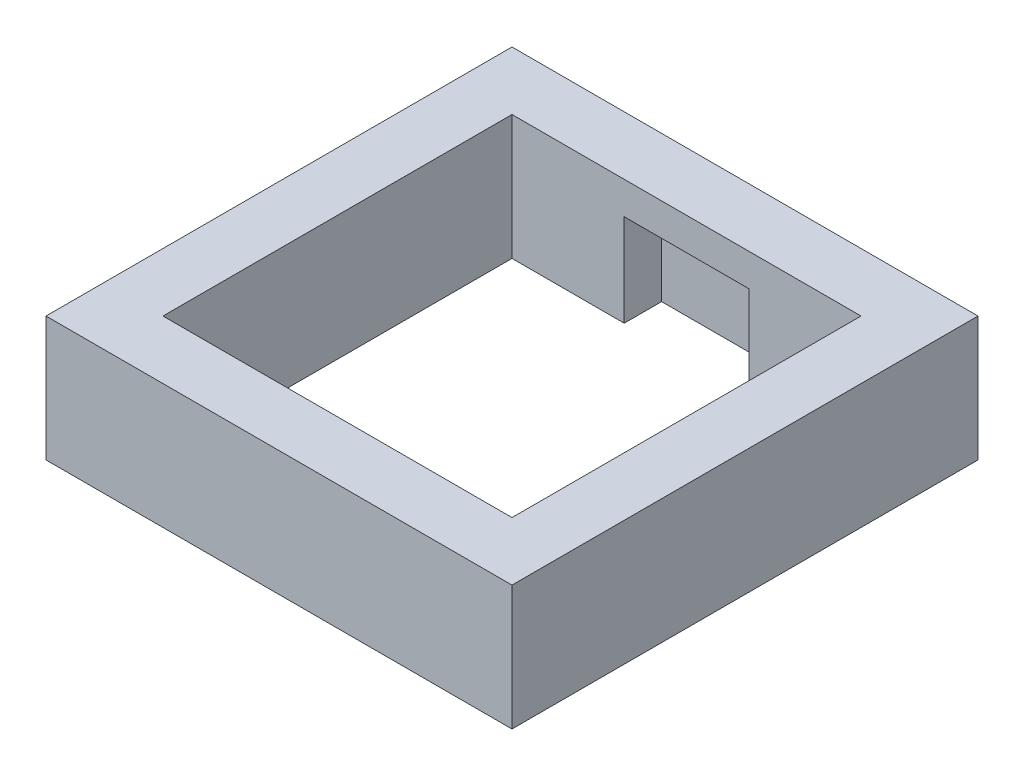
ISO-10303-21;
HEADER;
FILE_DESCRIPTION(('STEP AP214'),'2;1');
FILE_NAME('part.step','',(''),(''),'','','');
FILE_SCHEMA(('AUTOMOTIVE_DESIGN { 1 0 10303 214 1 1 1 1 }'));
ENDSEC;
DATA;
#1=APPLICATION_CONTEXT('core data for automotive mechanical design processes');
#2=APPLICATION_PROTOCOL_DEFINITION('international standard','automotive_design',2000,#1);
#3=PRODUCT_CONTEXT('',#1,'mechanical');
#4=PRODUCT('Part','Part','',(#3));
#5=PRODUCT_RELATED_PRODUCT_CATEGORY('part','',(#4));
#6=PRODUCT_DEFINITION_FORMATION('','',#4);
#7=PRODUCT_DEFINITION_CONTEXT('part definition',#1,'design');
#8=PRODUCT_DEFINITION('design','',#6,#7);
#9=PRODUCT_DEFINITION_SHAPE('','',#8);
#10=(LENGTH_UNIT() NAMED_UNIT(*) SI_UNIT(.MILLI.,.METRE.));
#11=(NAMED_UNIT(*) PLANE_ANGLE_UNIT() SI_UNIT($,.RADIAN.));
#12=(NAMED_UNIT(*) SI_UNIT($,.STERADIAN.) SOLID_ANGLE_UNIT());
#13=UNCERTAINTY_MEASURE_WITH_UNIT(LENGTH_MEASURE(1.E-05),#10,'distance_accuracy_value','');
#14=(GEOMETRIC_REPRESENTATION_CONTEXT(3) GLOBAL_UNCERTAINTY_ASSIGNED_CONTEXT((#13)) GLOBAL_UNIT_ASSIGNED_CONTEXT((#10,
#11,#12)) REPRESENTATION_CONTEXT('',''));
#15=CARTESIAN_POINT('',(0.,0.,0.));
#16=DIRECTION('',(0.,0.,1.));
#17=DIRECTION('',(1.,0.,0.));
#18=AXIS2_PLACEMENT_3D('',#15,#16,#17);
#19=CARTESIAN_POINT('',(0.,5.,-7.));
#20=DIRECTION('',(0.,0.,-1.));
#21=DIRECTION('',(-1.,0.,0.));
#22=AXIS2_PLACEMENT_3D('',#19,#20,#21);
#23=PLANE('',#22);
#24=DIRECTION('',(0.,-1.,0.));
#25=VECTOR('',#24,1.);
#26=CARTESIAN_POINT('',(-2.5,3.7,-7.));
#27=LINE('',#26,#25);
#28=CARTESIAN_POINT('',(-2.5,3.7,-7.));
#29=VERTEX_POINT('',#28);
#30=CARTESIAN_POINT('',(-2.5,0.,-7.));
#31=VERTEX_POINT('',#30);
#32=EDGE_CURVE('E192',#29,#31,#27,.T.);
#33=ORIENTED_EDGE('',*,*,#32,.F.);
#34=DIRECTION('',(-1.,0.,0.));
#35=VECTOR('',#34,1.);
#36=CARTESIAN_POINT('',(0.,3.7,-7.));
#37=LINE('',#36,#35);
#38=CARTESIAN_POINT('',(2.5,3.7,-7.));
#39=VERTEX_POINT('',#38);
#40=EDGE_CURVE('E170',#39,#29,#37,.T.);
#41=ORIENTED_EDGE('',*,*,#40,.F.);
#42=DIRECTION('',(0.,-1.,0.));
#43=VECTOR('',#42,1.);
#44=CARTESIAN_POINT('',(2.5,3.7,-7.));
#45=LINE('',#44,#43);
#46=CARTESIAN_POINT('',(2.5,0.,-7.));
#47=VERTEX_POINT('',#46);
#48=EDGE_CURVE('E196',#39,#47,#45,.T.);
#49=ORIENTED_EDGE('',*,*,#48,.T.);
#50=DIRECTION('',(1.,0.,0.));
#51=VECTOR('',#50,1.);
#52=CARTESIAN_POINT('',(0.,0.,-7.));
#53=LINE('',#52,#51);
#54=CARTESIAN_POINT('',(7.,0.,-7.));
#55=VERTEX_POINT('',#54);
#56=EDGE_CURVE('E195',#47,#55,#53,.T.);
#57=ORIENTED_EDGE('',*,*,#56,.T.);
#58=DIRECTION('',(0.,-1.,0.));
#59=VECTOR('',#58,1.);
#60=CARTESIAN_POINT('',(7.,5.,-7.));
#61=LINE('',#60,#59);
#62=CARTESIAN_POINT('',(7.,5.,-7.));
#63=VERTEX_POINT('',#62);
#64=EDGE_CURVE('E42',#63,#55,#61,.T.);
#65=ORIENTED_EDGE('',*,*,#64,.F.);
#66=DIRECTION('',(1.,0.,0.));
#67=VECTOR('',#66,1.);
#68=CARTESIAN_POINT('',(0.,5.,-7.));
#69=LINE('',#68,#67);
#70=CARTESIAN_POINT('',(-7.,5.,-7.));
#71=VERTEX_POINT('',#70);
#72=EDGE_CURVE('E238',#71,#63,#69,.T.);
#73=ORIENTED_EDGE('',*,*,#72,.F.);
#74=DIRECTION('',(0.,-1.,0.));
#75=VECTOR('',#74,1.);
#76=CARTESIAN_POINT('',(-7.,5.,-7.));
#77=LINE('',#76,#75);
#78=CARTESIAN_POINT('',(-7.,0.,-7.));
#79=VERTEX_POINT('',#78);
#80=EDGE_CURVE('E266',#71,#79,#77,.T.);
#81=ORIENTED_EDGE('',*,*,#80,.T.);
#82=EDGE_CURVE('E267',#79,#31,#53,.T.);
#83=ORIENTED_EDGE('',*,*,#82,.T.);
#84=EDGE_LOOP('',(#33,#41,#49,#57,#65,#73,#81,#83));
#85=FACE_BOUND('',#84,.T.);
#86=ADVANCED_FACE('F39',(#85),#23,.F.);
#87=CARTESIAN_POINT('',(0.,0.,0.));
#88=DIRECTION('',(0.,1.,0.));
#89=DIRECTION('',(0.,0.,1.));
#90=AXIS2_PLACEMENT_3D('',#87,#88,#89);
#91=PLANE('',#90);
#92=DIRECTION('',(0.,0.,-1.));
#93=VECTOR('',#92,1.);
#94=CARTESIAN_POINT('',(9.34569075164669,0.,0.));
#95=LINE('',#94,#93);
#96=CARTESIAN_POINT('',(9.34569075164674,0.,9.3456907516465));
#97=VERTEX_POINT('',#96);
#98=CARTESIAN_POINT('',(9.34569075164664,0.,-9.34569075164671));
#99=VERTEX_POINT('',#98);
#100=EDGE_CURVE('E282',#97,#99,#95,.T.);
#101=ORIENTED_EDGE('',*,*,#100,.F.);
#102=DIRECTION('',(-1.,0.,0.));
#103=VECTOR('',#102,1.);
#104=CARTESIAN_POINT('',(0.,0.,9.34569075164667));
#105=LINE('',#104,#103);
#106=CARTESIAN_POINT('',(-9.34569075164652,0.,9.34569075164667));
#107=VERTEX_POINT('',#106);
#108=EDGE_CURVE('E243',#97,#107,#105,.T.);
#109=ORIENTED_EDGE('',*,*,#108,.T.);
#110=DIRECTION('',(0.,0.,1.));
#111=VECTOR('',#110,1.);
#112=CARTESIAN_POINT('',(-9.34569075164664,0.,0.));
#113=LINE('',#112,#111);
#114=CARTESIAN_POINT('',(-9.34569075164664,0.,-9.34569075164661));
#115=VERTEX_POINT('',#114);
#116=EDGE_CURVE('E290',#115,#107,#113,.T.);
#117=ORIENTED_EDGE('',*,*,#116,.F.);
#118=DIRECTION('',(1.,0.,0.));
#119=VECTOR('',#118,1.);
#120=CARTESIAN_POINT('',(0.,0.,-9.34569075164666));
#121=LINE('',#120,#119);
#122=EDGE_CURVE('E286',#115,#99,#121,.T.);
#123=ORIENTED_EDGE('',*,*,#122,.T.);
#124=EDGE_LOOP('',(#101,#109,#117,#123));
#125=FACE_BOUND('',#124,.T.);
#126=DIRECTION('',(0.,0.,1.));
#127=VECTOR('',#126,1.);
#128=CARTESIAN_POINT('',(-2.5,0.,0.));
#129=LINE('',#128,#127);
#130=CARTESIAN_POINT('',(-2.5,0.,-8.5));
#131=VERTEX_POINT('',#130);
#132=EDGE_CURVE('E56',#131,#31,#129,.T.);
#133=ORIENTED_EDGE('',*,*,#132,.T.);
#134=ORIENTED_EDGE('',*,*,#82,.F.);
#135=DIRECTION('',(0.,0.,-1.));
#136=VECTOR('',#135,1.);
#137=CARTESIAN_POINT('',(-7.,0.,0.));
#138=LINE('',#137,#136);
#139=CARTESIAN_POINT('',(-7.,0.,7.));
#140=VERTEX_POINT('',#139);
#141=EDGE_CURVE('E279',#140,#79,#138,.T.);
#142=ORIENTED_EDGE('',*,*,#141,.F.);
#143=DIRECTION('',(-1.,0.,0.));
#144=VECTOR('',#143,1.);
#145=CARTESIAN_POINT('',(0.,0.,7.));
#146=LINE('',#145,#144);
#147=CARTESIAN_POINT('',(-2.5,0.,7.));
#148=VERTEX_POINT('',#147);
#149=EDGE_CURVE('E274',#148,#140,#146,.T.);
#150=ORIENTED_EDGE('',*,*,#149,.F.);
#151=DIRECTION('',(0.,0.,-1.));
#152=VECTOR('',#151,1.);
#153=CARTESIAN_POINT('',(-2.5,0.,0.));
#154=LINE('',#153,#152);
#155=CARTESIAN_POINT('',(-2.5,0.,8.5));
#156=VERTEX_POINT('',#155);
#157=EDGE_CURVE('E221',#156,#148,#154,.T.);
#158=ORIENTED_EDGE('',*,*,#157,.F.);
#159=DIRECTION('',(-1.,0.,0.));
#160=VECTOR('',#159,1.);
#161=CARTESIAN_POINT('',(0.,0.,8.5));
#162=LINE('',#161,#160);
#163=CARTESIAN_POINT('',(2.5,0.,8.5));
#164=VERTEX_POINT('',#163);
#165=EDGE_CURVE('E64',#164,#156,#162,.T.);
#166=ORIENTED_EDGE('',*,*,#165,.F.);
#167=DIRECTION('',(0.,0.,1.));
#168=VECTOR('',#167,1.);
#169=CARTESIAN_POINT('',(2.5,0.,0.));
#170=LINE('',#169,#168);
#171=CARTESIAN_POINT('',(2.5,0.,7.));
#172=VERTEX_POINT('',#171);
#173=EDGE_CURVE('E207',#172,#164,#170,.T.);
#174=ORIENTED_EDGE('',*,*,#173,.F.);
#175=CARTESIAN_POINT('',(7.,0.,7.));
#176=VERTEX_POINT('',#175);
#177=EDGE_CURVE('E275',#176,#172,#146,.T.);
#178=ORIENTED_EDGE('',*,*,#177,.F.);
#179=DIRECTION('',(0.,0.,1.));
#180=VECTOR('',#179,1.);
#181=CARTESIAN_POINT('',(7.,0.,0.));
#182=LINE('',#181,#180);
#183=EDGE_CURVE('E271',#55,#176,#182,.T.);
#184=ORIENTED_EDGE('',*,*,#183,.F.);
#185=ORIENTED_EDGE('',*,*,#56,.F.);
#186=DIRECTION('',(0.,0.,-1.));
#187=VECTOR('',#186,1.);
#188=CARTESIAN_POINT('',(2.5,0.,0.));
#189=LINE('',#188,#187);
#190=CARTESIAN_POINT('',(2.5,0.,-8.5));
#191=VERTEX_POINT('',#190);
#192=EDGE_CURVE('E176',#47,#191,#189,.T.);
#193=ORIENTED_EDGE('',*,*,#192,.T.);
#194=DIRECTION('',(-1.,0.,0.));
#195=VECTOR('',#194,1.);
#196=CARTESIAN_POINT('',(0.,0.,-8.5));
#197=LINE('',#196,#195);
#198=EDGE_CURVE('E180',#191,#131,#197,.T.);
#199=ORIENTED_EDGE('',*,*,#198,.T.);
#200=EDGE_LOOP('',(#133,#134,#142,#150,#158,#166,#174,#178,#184,#185,#193,#199));
#201=FACE_BOUND('',#200,.T.);
#202=ADVANCED_FACE('F329',(#125,#201),#91,.F.);
#203=CARTESIAN_POINT('',(9.34569075164669,5.,0.));
#204=DIRECTION('',(-1.,0.,0.));
#205=DIRECTION('',(0.,0.,1.));
#206=AXIS2_PLACEMENT_3D('',#203,#204,#205);
#207=PLANE('',#206);
#208=ORIENTED_EDGE('',*,*,#100,.T.);
#209=DIRECTION('',(0.,-1.,0.));
#210=VECTOR('',#209,1.);
#211=CARTESIAN_POINT('',(9.34569075164664,5.,-9.34569075164671));
#212=LINE('',#211,#210);
#213=CARTESIAN_POINT('',(9.34569075164664,5.,-9.34569075164671));
#214=VERTEX_POINT('',#213);
#215=EDGE_CURVE('E11',#214,#99,#212,.T.);
#216=ORIENTED_EDGE('',*,*,#215,.F.);
#217=DIRECTION('',(0.,0.,-1.));
#218=VECTOR('',#217,1.);
#219=CARTESIAN_POINT('',(9.34569075164669,5.,0.));
#220=LINE('',#219,#218);
#221=CARTESIAN_POINT('',(9.34569075164674,5.,9.3456907516465));
#222=VERTEX_POINT('',#221);
#223=EDGE_CURVE('E252',#222,#214,#220,.T.);
#224=ORIENTED_EDGE('',*,*,#223,.F.);
#225=DIRECTION('',(0.,-1.,0.));
#226=VECTOR('',#225,1.);
#227=CARTESIAN_POINT('',(9.34569075164674,5.,9.3456907516465));
#228=LINE('',#227,#226);
#229=EDGE_CURVE('E297',#222,#97,#228,.T.);
#230=ORIENTED_EDGE('',*,*,#229,.T.);
#231=EDGE_LOOP('',(#208,#216,#224,#230));
#232=FACE_BOUND('',#231,.T.);
#233=ADVANCED_FACE('F368',(#232),#207,.F.);
#234=CARTESIAN_POINT('',(0.,5.,-9.34569075164666));
#235=DIRECTION('',(0.,0.,-1.));
#236=DIRECTION('',(-1.,0.,0.));
#237=AXIS2_PLACEMENT_3D('',#234,#235,#236);
#238=PLANE('',#237);
#239=ORIENTED_EDGE('',*,*,#122,.F.);
#240=DIRECTION('',(0.,-1.,0.));
#241=VECTOR('',#240,1.);
#242=CARTESIAN_POINT('',(-9.34569075164664,5.,-9.34569075164661));
#243=LINE('',#242,#241);
#244=CARTESIAN_POINT('',(-9.34569075164664,5.,-9.34569075164661));
#245=VERTEX_POINT('',#244);
#246=EDGE_CURVE('E48',#245,#115,#243,.T.);
#247=ORIENTED_EDGE('',*,*,#246,.F.);
#248=DIRECTION('',(1.,0.,0.));
#249=VECTOR('',#248,1.);
#250=CARTESIAN_POINT('',(0.,5.,-9.34569075164666));
#251=LINE('',#250,#249);
#252=EDGE_CURVE('E255',#245,#214,#251,.T.);
#253=ORIENTED_EDGE('',*,*,#252,.T.);
#254=ORIENTED_EDGE('',*,*,#215,.T.);
#255=EDGE_LOOP('',(#239,#247,#253,#254));
#256=FACE_BOUND('',#255,.T.);
#257=ADVANCED_FACE('F374',(#256),#238,.T.);
#258=CARTESIAN_POINT('',(-9.34569075164664,5.,0.));
#259=DIRECTION('',(1.,0.,0.));
#260=DIRECTION('',(0.,0.,-1.));
#261=AXIS2_PLACEMENT_3D('',#258,#259,#260);
#262=PLANE('',#261);
#263=ORIENTED_EDGE('',*,*,#116,.T.);
#264=DIRECTION('',(0.,-1.,0.));
#265=VECTOR('',#264,1.);
#266=CARTESIAN_POINT('',(-9.34569075164652,5.,9.34569075164667));
#267=LINE('',#266,#265);
#268=CARTESIAN_POINT('',(-9.34569075164652,5.,9.34569075164667));
#269=VERTEX_POINT('',#268);
#270=EDGE_CURVE('E300',#269,#107,#267,.T.);
#271=ORIENTED_EDGE('',*,*,#270,.F.);
#272=DIRECTION('',(0.,0.,1.));
#273=VECTOR('',#272,1.);
#274=CARTESIAN_POINT('',(-9.34569075164664,5.,0.));
#275=LINE('',#274,#273);
#276=EDGE_CURVE('E259',#245,#269,#275,.T.);
#277=ORIENTED_EDGE('',*,*,#276,.F.);
#278=ORIENTED_EDGE('',*,*,#246,.T.);
#279=EDGE_LOOP('',(#263,#271,#277,#278));
#280=FACE_BOUND('',#279,.T.);
#281=ADVANCED_FACE('F386',(#280),#262,.F.);
#282=CARTESIAN_POINT('',(7.,5.,0.));
#283=DIRECTION('',(1.,0.,0.));
#284=DIRECTION('',(0.,0.,-1.));
#285=AXIS2_PLACEMENT_3D('',#282,#283,#284);
#286=PLANE('',#285);
#287=ORIENTED_EDGE('',*,*,#183,.T.);
#288=DIRECTION('',(0.,-1.,0.));
#289=VECTOR('',#288,1.);
#290=CARTESIAN_POINT('',(7.,5.,7.));
#291=LINE('',#290,#289);
#292=CARTESIAN_POINT('',(7.,5.,7.));
#293=VERTEX_POINT('',#292);
#294=EDGE_CURVE('E311',#293,#176,#291,.T.);
#295=ORIENTED_EDGE('',*,*,#294,.F.);
#296=DIRECTION('',(0.,0.,1.));
#297=VECTOR('',#296,1.);
#298=CARTESIAN_POINT('',(7.,5.,0.));
#299=LINE('',#298,#297);
#300=EDGE_CURVE('E242',#63,#293,#299,.T.);
#301=ORIENTED_EDGE('',*,*,#300,.F.);
#302=ORIENTED_EDGE('',*,*,#64,.T.);
#303=EDGE_LOOP('',(#287,#295,#301,#302));
#304=FACE_BOUND('',#303,.T.);
#305=ADVANCED_FACE('F322',(#304),#286,.F.);
#306=CARTESIAN_POINT('',(0.,5.,7.));
#307=DIRECTION('',(0.,0.,1.));
#308=DIRECTION('',(1.,0.,0.));
#309=AXIS2_PLACEMENT_3D('',#306,#307,#308);
#310=PLANE('',#309);
#311=ORIENTED_EDGE('',*,*,#177,.T.);
#312=DIRECTION('',(0.,-1.,0.));
#313=VECTOR('',#312,1.);
#314=CARTESIAN_POINT('',(2.5,3.7,7.));
#315=LINE('',#314,#313);
#316=CARTESIAN_POINT('',(2.5,3.7,7.));
#317=VERTEX_POINT('',#316);
#318=EDGE_CURVE('E229',#317,#172,#315,.T.);
#319=ORIENTED_EDGE('',*,*,#318,.F.);
#320=DIRECTION('',(1.,0.,0.));
#321=VECTOR('',#320,1.);
#322=CARTESIAN_POINT('',(0.,3.7,7.));
#323=LINE('',#322,#321);
#324=CARTESIAN_POINT('',(-2.5,3.7,7.));
#325=VERTEX_POINT('',#324);
#326=EDGE_CURVE('E211',#325,#317,#323,.T.);
#327=ORIENTED_EDGE('',*,*,#326,.F.);
#328=DIRECTION('',(0.,-1.,0.));
#329=VECTOR('',#328,1.);
#330=CARTESIAN_POINT('',(-2.5,3.7,7.));
#331=LINE('',#330,#329);
#332=EDGE_CURVE('E232',#325,#148,#331,.T.);
#333=ORIENTED_EDGE('',*,*,#332,.T.);
#334=ORIENTED_EDGE('',*,*,#149,.T.);
#335=DIRECTION('',(0.,-1.,0.));
#336=VECTOR('',#335,1.);
#337=CARTESIAN_POINT('',(-7.,5.,7.));
#338=LINE('',#337,#336);
#339=CARTESIAN_POINT('',(-7.,5.,7.));
#340=VERTEX_POINT('',#339);
#341=EDGE_CURVE('E308',#340,#140,#338,.T.);
#342=ORIENTED_EDGE('',*,*,#341,.F.);
#343=DIRECTION('',(-1.,0.,0.));
#344=VECTOR('',#343,1.);
#345=CARTESIAN_POINT('',(0.,5.,7.));
#346=LINE('',#345,#344);
#347=EDGE_CURVE('E246',#293,#340,#346,.T.);
#348=ORIENTED_EDGE('',*,*,#347,.F.);
#349=ORIENTED_EDGE('',*,*,#294,.T.);
#350=EDGE_LOOP('',(#311,#319,#327,#333,#334,#342,#348,#349));
#351=FACE_BOUND('',#350,.T.);
#352=ADVANCED_FACE('F332',(#351),#310,.F.);
#353=CARTESIAN_POINT('',(-7.,5.,0.));
#354=DIRECTION('',(-1.,0.,0.));
#355=DIRECTION('',(0.,0.,1.));
#356=AXIS2_PLACEMENT_3D('',#353,#354,#355);
#357=PLANE('',#356);
#358=ORIENTED_EDGE('',*,*,#141,.T.);
#359=ORIENTED_EDGE('',*,*,#80,.F.);
#360=DIRECTION('',(0.,0.,-1.));
#361=VECTOR('',#360,1.);
#362=CARTESIAN_POINT('',(-7.,5.,0.));
#363=LINE('',#362,#361);
#364=EDGE_CURVE('E249',#340,#71,#363,.T.);
#365=ORIENTED_EDGE('',*,*,#364,.F.);
#366=ORIENTED_EDGE('',*,*,#341,.T.);
#367=EDGE_LOOP('',(#358,#359,#365,#366));
#368=FACE_BOUND('',#367,.T.);
#369=ADVANCED_FACE('F351',(#368),#357,.F.);
#370=CARTESIAN_POINT('',(0.,5.,9.34569075164667));
#371=DIRECTION('',(0.,0.,1.));
#372=DIRECTION('',(1.,0.,0.));
#373=AXIS2_PLACEMENT_3D('',#370,#371,#372);
#374=PLANE('',#373);
#375=ORIENTED_EDGE('',*,*,#108,.F.);
#376=ORIENTED_EDGE('',*,*,#229,.F.);
#377=DIRECTION('',(-1.,0.,0.));
#378=VECTOR('',#377,1.);
#379=CARTESIAN_POINT('',(0.,5.,9.34569075164667));
#380=LINE('',#379,#378);
#381=EDGE_CURVE('E262',#222,#269,#380,.T.);
#382=ORIENTED_EDGE('',*,*,#381,.T.);
#383=ORIENTED_EDGE('',*,*,#270,.T.);
#384=EDGE_LOOP('',(#375,#376,#382,#383));
#385=FACE_BOUND('',#384,.T.);
#386=ADVANCED_FACE('F382',(#385),#374,.T.);
#387=CARTESIAN_POINT('',(0.,5.,0.));
#388=DIRECTION('',(0.,1.,0.));
#389=DIRECTION('',(0.,0.,1.));
#390=AXIS2_PLACEMENT_3D('',#387,#388,#389);
#391=PLANE('',#390);
#392=ORIENTED_EDGE('',*,*,#72,.T.);
#393=ORIENTED_EDGE('',*,*,#300,.T.);
#394=ORIENTED_EDGE('',*,*,#347,.T.);
#395=ORIENTED_EDGE('',*,*,#364,.T.);
#396=EDGE_LOOP('',(#392,#393,#394,#395));
#397=FACE_BOUND('',#396,.T.);
#398=ORIENTED_EDGE('',*,*,#223,.T.);
#399=ORIENTED_EDGE('',*,*,#252,.F.);
#400=ORIENTED_EDGE('',*,*,#276,.T.);
#401=ORIENTED_EDGE('',*,*,#381,.F.);
#402=EDGE_LOOP('',(#398,#399,#400,#401));
#403=FACE_BOUND('',#402,.T.);
#404=ADVANCED_FACE('F380',(#397,#403),#391,.T.);
#405=CARTESIAN_POINT('',(0.,3.7,8.5));
#406=DIRECTION('',(0.,0.,1.));
#407=DIRECTION('',(1.,0.,0.));
#408=AXIS2_PLACEMENT_3D('',#405,#406,#407);
#409=PLANE('',#408);
#410=ORIENTED_EDGE('',*,*,#165,.T.);
#411=DIRECTION('',(0.,-1.,0.));
#412=VECTOR('',#411,1.);
#413=CARTESIAN_POINT('',(-2.5,3.7,8.5));
#414=LINE('',#413,#412);
#415=CARTESIAN_POINT('',(-2.5,3.7,8.5));
#416=VERTEX_POINT('',#415);
#417=EDGE_CURVE('E218',#416,#156,#414,.T.);
#418=ORIENTED_EDGE('',*,*,#417,.F.);
#419=DIRECTION('',(-1.,0.,0.));
#420=VECTOR('',#419,1.);
#421=CARTESIAN_POINT('',(0.,3.7,8.5));
#422=LINE('',#421,#420);
#423=CARTESIAN_POINT('',(2.5,3.7,8.5));
#424=VERTEX_POINT('',#423);
#425=EDGE_CURVE('E202',#424,#416,#422,.T.);
#426=ORIENTED_EDGE('',*,*,#425,.F.);
#427=DIRECTION('',(0.,-1.,0.));
#428=VECTOR('',#427,1.);
#429=CARTESIAN_POINT('',(2.5,3.7,8.5));
#430=LINE('',#429,#428);
#431=EDGE_CURVE('E189',#424,#164,#430,.T.);
#432=ORIENTED_EDGE('',*,*,#431,.T.);
#433=EDGE_LOOP('',(#410,#418,#426,#432));
#434=FACE_BOUND('',#433,.T.);
#435=ADVANCED_FACE('F420',(#434),#409,.F.);
#436=CARTESIAN_POINT('',(2.5,3.7,0.));
#437=DIRECTION('',(1.,0.,0.));
#438=DIRECTION('',(0.,0.,-1.));
#439=AXIS2_PLACEMENT_3D('',#436,#437,#438);
#440=PLANE('',#439);
#441=ORIENTED_EDGE('',*,*,#173,.T.);
#442=ORIENTED_EDGE('',*,*,#431,.F.);
#443=DIRECTION('',(0.,0.,1.));
#444=VECTOR('',#443,1.);
#445=CARTESIAN_POINT('',(2.5,3.7,0.));
#446=LINE('',#445,#444);
#447=EDGE_CURVE('E214',#317,#424,#446,.T.);
#448=ORIENTED_EDGE('',*,*,#447,.F.);
#449=ORIENTED_EDGE('',*,*,#318,.T.);
#450=EDGE_LOOP('',(#441,#442,#448,#449));
#451=FACE_BOUND('',#450,.T.);
#452=ADVANCED_FACE('F336',(#451),#440,.F.);
#453=CARTESIAN_POINT('',(-2.5,3.7,0.));
#454=DIRECTION('',(-1.,0.,0.));
#455=DIRECTION('',(0.,0.,1.));
#456=AXIS2_PLACEMENT_3D('',#453,#454,#455);
#457=PLANE('',#456);
#458=ORIENTED_EDGE('',*,*,#157,.T.);
#459=ORIENTED_EDGE('',*,*,#332,.F.);
#460=DIRECTION('',(0.,0.,-1.));
#461=VECTOR('',#460,1.);
#462=CARTESIAN_POINT('',(-2.5,3.7,0.));
#463=LINE('',#462,#461);
#464=EDGE_CURVE('E206',#416,#325,#463,.T.);
#465=ORIENTED_EDGE('',*,*,#464,.F.);
#466=ORIENTED_EDGE('',*,*,#417,.T.);
#467=EDGE_LOOP('',(#458,#459,#465,#466));
#468=FACE_BOUND('',#467,.T.);
#469=ADVANCED_FACE('F342',(#468),#457,.F.);
#470=CARTESIAN_POINT('',(0.,3.7,0.));
#471=DIRECTION('',(0.,-1.,0.));
#472=DIRECTION('',(0.,0.,-1.));
#473=AXIS2_PLACEMENT_3D('',#470,#471,#472);
#474=PLANE('',#473);
#475=ORIENTED_EDGE('',*,*,#425,.T.);
#476=ORIENTED_EDGE('',*,*,#464,.T.);
#477=ORIENTED_EDGE('',*,*,#326,.T.);
#478=ORIENTED_EDGE('',*,*,#447,.T.);
#479=EDGE_LOOP('',(#475,#476,#477,#478));
#480=FACE_BOUND('',#479,.T.);
#481=ADVANCED_FACE('F339',(#480),#474,.T.);
#482=CARTESIAN_POINT('',(-2.5,3.7,0.));
#483=DIRECTION('',(1.,0.,0.));
#484=DIRECTION('',(0.,0.,-1.));
#485=AXIS2_PLACEMENT_3D('',#482,#483,#484);
#486=PLANE('',#485);
#487=ORIENTED_EDGE('',*,*,#132,.F.);
#488=DIRECTION('',(0.,-1.,0.));
#489=VECTOR('',#488,1.);
#490=CARTESIAN_POINT('',(-2.5,3.7,-8.5));
#491=LINE('',#490,#489);
#492=CARTESIAN_POINT('',(-2.5,3.7,-8.5));
#493=VERTEX_POINT('',#492);
#494=EDGE_CURVE('E157',#493,#131,#491,.T.);
#495=ORIENTED_EDGE('',*,*,#494,.F.);
#496=DIRECTION('',(0.,0.,1.));
#497=VECTOR('',#496,1.);
#498=CARTESIAN_POINT('',(-2.5,3.7,0.));
#499=LINE('',#498,#497);
#500=EDGE_CURVE('E165',#493,#29,#499,.T.);
#501=ORIENTED_EDGE('',*,*,#500,.T.);
#502=ORIENTED_EDGE('',*,*,#32,.T.);
#503=EDGE_LOOP('',(#487,#495,#501,#502));
#504=FACE_BOUND('',#503,.T.);
#505=ADVANCED_FACE('F167',(#504),#486,.T.);
#506=CARTESIAN_POINT('',(2.5,3.7,0.));
#507=DIRECTION('',(-1.,0.,0.));
#508=DIRECTION('',(0.,0.,1.));
#509=AXIS2_PLACEMENT_3D('',#506,#507,#508);
#510=PLANE('',#509);
#511=ORIENTED_EDGE('',*,*,#192,.F.);
#512=ORIENTED_EDGE('',*,*,#48,.F.);
#513=DIRECTION('',(0.,0.,-1.));
#514=VECTOR('',#513,1.);
#515=CARTESIAN_POINT('',(2.5,3.7,0.));
#516=LINE('',#515,#514);
#517=CARTESIAN_POINT('',(2.5,3.7,-8.5));
#518=VERTEX_POINT('',#517);
#519=EDGE_CURVE('E164',#39,#518,#516,.T.);
#520=ORIENTED_EDGE('',*,*,#519,.T.);
#521=DIRECTION('',(0.,-1.,0.));
#522=VECTOR('',#521,1.);
#523=CARTESIAN_POINT('',(2.5,3.7,-8.5));
#524=LINE('',#523,#522);
#525=EDGE_CURVE('E159',#518,#191,#524,.T.);
#526=ORIENTED_EDGE('',*,*,#525,.T.);
#527=EDGE_LOOP('',(#511,#512,#520,#526));
#528=FACE_BOUND('',#527,.T.);
#529=ADVANCED_FACE('F354',(#528),#510,.T.);
#530=CARTESIAN_POINT('',(0.,3.7,-8.5));
#531=DIRECTION('',(0.,0.,1.));
#532=DIRECTION('',(1.,0.,0.));
#533=AXIS2_PLACEMENT_3D('',#530,#531,#532);
#534=PLANE('',#533);
#535=ORIENTED_EDGE('',*,*,#198,.F.);
#536=ORIENTED_EDGE('',*,*,#525,.F.);
#537=DIRECTION('',(-1.,0.,0.));
#538=VECTOR('',#537,1.);
#539=CARTESIAN_POINT('',(0.,3.7,-8.5));
#540=LINE('',#539,#538);
#541=EDGE_CURVE('E154',#518,#493,#540,.T.);
#542=ORIENTED_EDGE('',*,*,#541,.T.);
#543=ORIENTED_EDGE('',*,*,#494,.T.);
#544=EDGE_LOOP('',(#535,#536,#542,#543));
#545=FACE_BOUND('',#544,.T.);
#546=ADVANCED_FACE('F156',(#545),#534,.T.);
#547=CARTESIAN_POINT('',(0.,3.7,0.));
#548=DIRECTION('',(0.,-1.,0.));
#549=DIRECTION('',(0.,0.,-1.));
#550=AXIS2_PLACEMENT_3D('',#547,#548,#549);
#551=PLANE('',#550);
#552=ORIENTED_EDGE('',*,*,#500,.F.);
#553=ORIENTED_EDGE('',*,*,#541,.F.);
#554=ORIENTED_EDGE('',*,*,#519,.F.);
#555=ORIENTED_EDGE('',*,*,#40,.T.);
#556=EDGE_LOOP('',(#552,#553,#554,#555));
#557=FACE_BOUND('',#556,.T.);
#558=ADVANCED_FACE('F172',(#557),#551,.T.);
#559=CLOSED_SHELL('',(#86,#202,#233,#257,#281,#305,#352,#369,#386,#404,#435,#452,#469,#481,#505,
#529,#546,#558));
#560=MANIFOLD_SOLID_BREP('B2',#559);
#561=ADVANCED_BREP_SHAPE_REPRESENTATION('',(#18,#560),#14);
#562=SHAPE_DEFINITION_REPRESENTATION(#9,#561);
ENDSEC;
END-ISO-10303-21;
